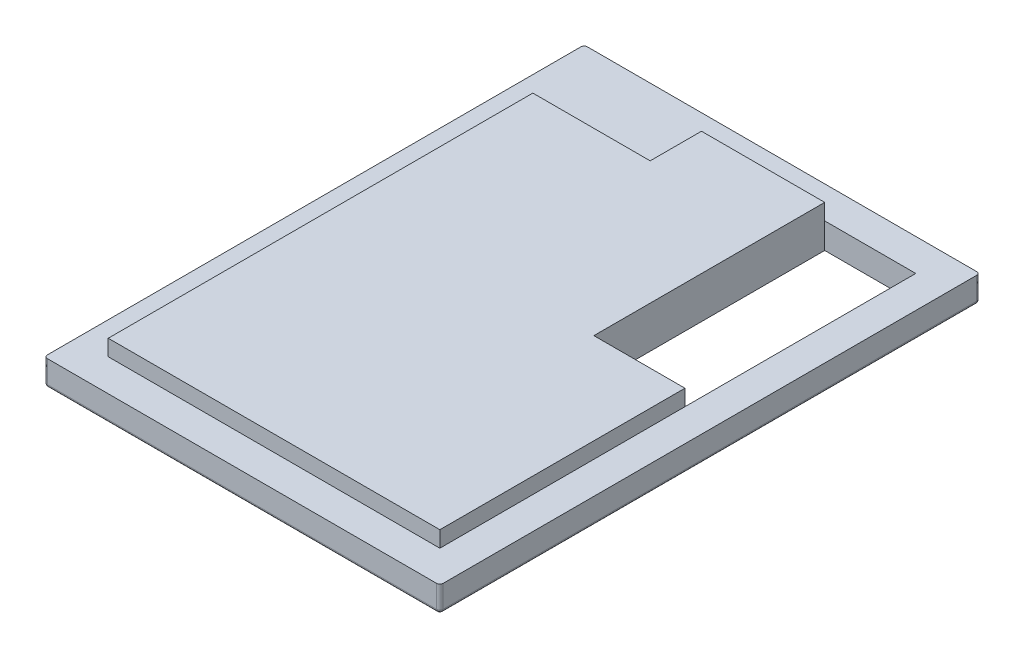
ISO-10303-21;
HEADER;
FILE_DESCRIPTION(('STEP AP214'),'2;1');
FILE_NAME('part.step','',(''),(''),'','','');
FILE_SCHEMA(('AUTOMOTIVE_DESIGN { 1 0 10303 214 1 1 1 1 }'));
ENDSEC;
DATA;
#1=APPLICATION_CONTEXT('core data for automotive mechanical design processes');
#2=APPLICATION_PROTOCOL_DEFINITION('international standard','automotive_design',2000,#1);
#3=PRODUCT_CONTEXT('',#1,'mechanical');
#4=PRODUCT('Part','Part','',(#3));
#5=PRODUCT_RELATED_PRODUCT_CATEGORY('part','',(#4));
#6=PRODUCT_DEFINITION_FORMATION('','',#4);
#7=PRODUCT_DEFINITION_CONTEXT('part definition',#1,'design');
#8=PRODUCT_DEFINITION('design','',#6,#7);
#9=PRODUCT_DEFINITION_SHAPE('','',#8);
#10=(LENGTH_UNIT() NAMED_UNIT(*) SI_UNIT(.MILLI.,.METRE.));
#11=(NAMED_UNIT(*) PLANE_ANGLE_UNIT() SI_UNIT($,.RADIAN.));
#12=(NAMED_UNIT(*) SI_UNIT($,.STERADIAN.) SOLID_ANGLE_UNIT());
#13=UNCERTAINTY_MEASURE_WITH_UNIT(LENGTH_MEASURE(1.E-05),#10,'distance_accuracy_value','');
#14=(GEOMETRIC_REPRESENTATION_CONTEXT(3) GLOBAL_UNCERTAINTY_ASSIGNED_CONTEXT((#13)) GLOBAL_UNIT_ASSIGNED_CONTEXT((#10,
#11,#12)) REPRESENTATION_CONTEXT('',''));
#15=CARTESIAN_POINT('',(0.,0.,0.));
#16=DIRECTION('',(0.,0.,1.));
#17=DIRECTION('',(1.,0.,0.));
#18=AXIS2_PLACEMENT_3D('',#15,#16,#17);
#19=CARTESIAN_POINT('',(15.43,3.25,21.055));
#20=DIRECTION('',(-1.,0.,0.));
#21=DIRECTION('',(0.,0.,1.));
#22=AXIS2_PLACEMENT_3D('',#19,#20,#21);
#23=PLANE('',#22);
#24=DIRECTION('',(0.,0.,-1.));
#25=VECTOR('',#24,1.);
#26=CARTESIAN_POINT('',(15.43,0.25,-21.055));
#27=LINE('',#26,#25);
#28=CARTESIAN_POINT('',(15.43,0.25,20.805));
#29=VERTEX_POINT('',#28);
#30=CARTESIAN_POINT('',(15.43,0.25,-20.805));
#31=VERTEX_POINT('',#30);
#32=EDGE_CURVE('E231',#29,#31,#27,.T.);
#33=ORIENTED_EDGE('',*,*,#32,.T.);
#34=DIRECTION('',(0.,-1.,0.));
#35=VECTOR('',#34,1.);
#36=CARTESIAN_POINT('',(15.43,3.25,-20.805));
#37=LINE('',#36,#35);
#38=CARTESIAN_POINT('',(15.43,2.,-20.805));
#39=VERTEX_POINT('',#38);
#40=EDGE_CURVE('E234',#31,#39,#37,.F.);
#41=ORIENTED_EDGE('',*,*,#40,.T.);
#42=DIRECTION('',(0.,0.,-1.));
#43=VECTOR('',#42,1.);
#44=CARTESIAN_POINT('',(15.43,2.,21.055));
#45=LINE('',#44,#43);
#46=CARTESIAN_POINT('',(15.43,2.,20.805));
#47=VERTEX_POINT('',#46);
#48=EDGE_CURVE('E223',#47,#39,#45,.T.);
#49=ORIENTED_EDGE('',*,*,#48,.F.);
#50=DIRECTION('',(0.,-1.,0.));
#51=VECTOR('',#50,1.);
#52=CARTESIAN_POINT('',(15.43,3.25,20.805));
#53=LINE('',#52,#51);
#54=EDGE_CURVE('E229',#47,#29,#53,.T.);
#55=ORIENTED_EDGE('',*,*,#54,.T.);
#56=EDGE_LOOP('',(#33,#41,#49,#55));
#57=FACE_BOUND('',#56,.T.);
#58=ADVANCED_FACE('F36',(#57),#23,.F.);
#59=CARTESIAN_POINT('',(-15.43,3.25,-21.055));
#60=DIRECTION('',(0.,0.,1.));
#61=DIRECTION('',(1.,0.,0.));
#62=AXIS2_PLACEMENT_3D('',#59,#60,#61);
#63=PLANE('',#62);
#64=DIRECTION('',(-1.,0.,0.));
#65=VECTOR('',#64,1.);
#66=CARTESIAN_POINT('',(-15.43,2.,-21.055));
#67=LINE('',#66,#65);
#68=CARTESIAN_POINT('',(15.18,2.,-21.055));
#69=VERTEX_POINT('',#68);
#70=CARTESIAN_POINT('',(-15.18,2.,-21.055));
#71=VERTEX_POINT('',#70);
#72=EDGE_CURVE('E220',#69,#71,#67,.T.);
#73=ORIENTED_EDGE('',*,*,#72,.F.);
#74=DIRECTION('',(0.,-1.,0.));
#75=VECTOR('',#74,1.);
#76=CARTESIAN_POINT('',(15.18,3.25,-21.055));
#77=LINE('',#76,#75);
#78=CARTESIAN_POINT('',(15.18,0.25,-21.055));
#79=VERTEX_POINT('',#78);
#80=EDGE_CURVE('E249',#69,#79,#77,.T.);
#81=ORIENTED_EDGE('',*,*,#80,.T.);
#82=DIRECTION('',(-1.,0.,0.));
#83=VECTOR('',#82,1.);
#84=CARTESIAN_POINT('',(-15.43,0.25,-21.055));
#85=LINE('',#84,#83);
#86=CARTESIAN_POINT('',(-15.18,0.25,-21.055));
#87=VERTEX_POINT('',#86);
#88=EDGE_CURVE('E247',#79,#87,#85,.T.);
#89=ORIENTED_EDGE('',*,*,#88,.T.);
#90=DIRECTION('',(0.,-1.,0.));
#91=VECTOR('',#90,1.);
#92=CARTESIAN_POINT('',(-15.18,3.25,-21.055));
#93=LINE('',#92,#91);
#94=EDGE_CURVE('E245',#87,#71,#93,.F.);
#95=ORIENTED_EDGE('',*,*,#94,.T.);
#96=EDGE_LOOP('',(#73,#81,#89,#95));
#97=FACE_BOUND('',#96,.T.);
#98=ADVANCED_FACE('F335',(#97),#63,.F.);
#99=CARTESIAN_POINT('',(-15.43,3.25,21.055));
#100=DIRECTION('',(1.,0.,0.));
#101=DIRECTION('',(0.,0.,-1.));
#102=AXIS2_PLACEMENT_3D('',#99,#100,#101);
#103=PLANE('',#102);
#104=DIRECTION('',(0.,0.,1.));
#105=VECTOR('',#104,1.);
#106=CARTESIAN_POINT('',(-15.43,2.,21.055));
#107=LINE('',#106,#105);
#108=CARTESIAN_POINT('',(-15.43,2.,-20.805));
#109=VERTEX_POINT('',#108);
#110=CARTESIAN_POINT('',(-15.43,2.,20.805));
#111=VERTEX_POINT('',#110);
#112=EDGE_CURVE('E216',#109,#111,#107,.T.);
#113=ORIENTED_EDGE('',*,*,#112,.F.);
#114=DIRECTION('',(0.,-1.,0.));
#115=VECTOR('',#114,1.);
#116=CARTESIAN_POINT('',(-15.43,3.25,-20.805));
#117=LINE('',#116,#115);
#118=CARTESIAN_POINT('',(-15.43,0.25,-20.805));
#119=VERTEX_POINT('',#118);
#120=EDGE_CURVE('E263',#109,#119,#117,.T.);
#121=ORIENTED_EDGE('',*,*,#120,.T.);
#122=DIRECTION('',(0.,0.,1.));
#123=VECTOR('',#122,1.);
#124=CARTESIAN_POINT('',(-15.43,0.25,21.055));
#125=LINE('',#124,#123);
#126=CARTESIAN_POINT('',(-15.43,0.25,20.805));
#127=VERTEX_POINT('',#126);
#128=EDGE_CURVE('E261',#119,#127,#125,.T.);
#129=ORIENTED_EDGE('',*,*,#128,.T.);
#130=DIRECTION('',(0.,-1.,0.));
#131=VECTOR('',#130,1.);
#132=CARTESIAN_POINT('',(-15.43,3.25,20.805));
#133=LINE('',#132,#131);
#134=EDGE_CURVE('E259',#127,#111,#133,.F.);
#135=ORIENTED_EDGE('',*,*,#134,.T.);
#136=EDGE_LOOP('',(#113,#121,#129,#135));
#137=FACE_BOUND('',#136,.T.);
#138=ADVANCED_FACE('F357',(#137),#103,.F.);
#139=CARTESIAN_POINT('',(-15.43,3.25,21.055));
#140=DIRECTION('',(0.,0.,-1.));
#141=DIRECTION('',(-1.,0.,0.));
#142=AXIS2_PLACEMENT_3D('',#139,#140,#141);
#143=PLANE('',#142);
#144=DIRECTION('',(1.,0.,0.));
#145=VECTOR('',#144,1.);
#146=CARTESIAN_POINT('',(-15.43,2.,21.055));
#147=LINE('',#146,#145);
#148=CARTESIAN_POINT('',(-15.18,2.,21.055));
#149=VERTEX_POINT('',#148);
#150=CARTESIAN_POINT('',(15.18,2.,21.055));
#151=VERTEX_POINT('',#150);
#152=EDGE_CURVE('E226',#149,#151,#147,.T.);
#153=ORIENTED_EDGE('',*,*,#152,.F.);
#154=DIRECTION('',(0.,-1.,0.));
#155=VECTOR('',#154,1.);
#156=CARTESIAN_POINT('',(-15.18,3.25,21.055));
#157=LINE('',#156,#155);
#158=CARTESIAN_POINT('',(-15.18,0.25,21.055));
#159=VERTEX_POINT('',#158);
#160=EDGE_CURVE('E13',#149,#159,#157,.T.);
#161=ORIENTED_EDGE('',*,*,#160,.T.);
#162=DIRECTION('',(1.,0.,0.));
#163=VECTOR('',#162,1.);
#164=CARTESIAN_POINT('',(15.43,0.25,21.055));
#165=LINE('',#164,#163);
#166=CARTESIAN_POINT('',(15.18,0.25,21.055));
#167=VERTEX_POINT('',#166);
#168=EDGE_CURVE('E45',#159,#167,#165,.T.);
#169=ORIENTED_EDGE('',*,*,#168,.T.);
#170=DIRECTION('',(0.,-1.,0.));
#171=VECTOR('',#170,1.);
#172=CARTESIAN_POINT('',(15.18,3.25,21.055));
#173=LINE('',#172,#171);
#174=EDGE_CURVE('E265',#167,#151,#173,.F.);
#175=ORIENTED_EDGE('',*,*,#174,.T.);
#176=EDGE_LOOP('',(#153,#161,#169,#175));
#177=FACE_BOUND('',#176,.T.);
#178=ADVANCED_FACE('F315',(#177),#143,.F.);
#179=CARTESIAN_POINT('',(0.,0.,0.));
#180=DIRECTION('',(0.,-1.,0.));
#181=DIRECTION('',(0.,0.,-1.));
#182=AXIS2_PLACEMENT_3D('',#179,#180,#181);
#183=PLANE('',#182);
#184=DIRECTION('',(0.,0.,1.));
#185=VECTOR('',#184,1.);
#186=CARTESIAN_POINT('',(12.93,0.,-18.555));
#187=LINE('',#186,#185);
#188=CARTESIAN_POINT('',(12.93,0.,-18.555));
#189=VERTEX_POINT('',#188);
#190=CARTESIAN_POINT('',(12.93,0.,-0.555000000000003));
#191=VERTEX_POINT('',#190);
#192=EDGE_CURVE('E61',#189,#191,#187,.T.);
#193=ORIENTED_EDGE('',*,*,#192,.F.);
#194=DIRECTION('',(1.,0.,0.));
#195=VECTOR('',#194,1.);
#196=CARTESIAN_POINT('',(12.93,0.,-18.555));
#197=LINE('',#196,#195);
#198=CARTESIAN_POINT('',(5.82999999999999,0.,-18.555));
#199=VERTEX_POINT('',#198);
#200=EDGE_CURVE('E621',#199,#189,#197,.T.);
#201=ORIENTED_EDGE('',*,*,#200,.F.);
#202=DIRECTION('',(0.,0.,-1.));
#203=VECTOR('',#202,1.);
#204=CARTESIAN_POINT('',(5.82999999999999,0.,-18.555));
#205=LINE('',#204,#203);
#206=CARTESIAN_POINT('',(5.82999999999999,0.,-0.555000000000003));
#207=VERTEX_POINT('',#206);
#208=EDGE_CURVE('E626',#207,#199,#205,.T.);
#209=ORIENTED_EDGE('',*,*,#208,.F.);
#210=DIRECTION('',(-1.,0.,0.));
#211=VECTOR('',#210,1.);
#212=CARTESIAN_POINT('',(12.93,0.,-0.555000000000003));
#213=LINE('',#212,#211);
#214=EDGE_CURVE('E623',#191,#207,#213,.T.);
#215=ORIENTED_EDGE('',*,*,#214,.F.);
#216=EDGE_LOOP('',(#193,#201,#209,#215));
#217=FACE_BOUND('',#216,.T.);
#218=DIRECTION('',(-1.,0.,0.));
#219=VECTOR('',#218,1.);
#220=CARTESIAN_POINT('',(15.43,0.,-20.805));
#221=LINE('',#220,#219);
#222=CARTESIAN_POINT('',(-15.18,0.,-20.805));
#223=VERTEX_POINT('',#222);
#224=CARTESIAN_POINT('',(15.18,0.,-20.805));
#225=VERTEX_POINT('',#224);
#226=EDGE_CURVE('E240',#223,#225,#221,.F.);
#227=ORIENTED_EDGE('',*,*,#226,.T.);
#228=DIRECTION('',(0.,0.,-1.));
#229=VECTOR('',#228,1.);
#230=CARTESIAN_POINT('',(15.18,0.,21.055));
#231=LINE('',#230,#229);
#232=CARTESIAN_POINT('',(15.18,0.,20.805));
#233=VERTEX_POINT('',#232);
#234=EDGE_CURVE('E242',#225,#233,#231,.F.);
#235=ORIENTED_EDGE('',*,*,#234,.T.);
#236=DIRECTION('',(1.,0.,0.));
#237=VECTOR('',#236,1.);
#238=CARTESIAN_POINT('',(-15.43,0.,20.805));
#239=LINE('',#238,#237);
#240=CARTESIAN_POINT('',(-15.18,0.,20.805));
#241=VERTEX_POINT('',#240);
#242=EDGE_CURVE('E236',#233,#241,#239,.F.);
#243=ORIENTED_EDGE('',*,*,#242,.T.);
#244=DIRECTION('',(0.,0.,1.));
#245=VECTOR('',#244,1.);
#246=CARTESIAN_POINT('',(-15.18,0.,-21.055));
#247=LINE('',#246,#245);
#248=EDGE_CURVE('E238',#241,#223,#247,.F.);
#249=ORIENTED_EDGE('',*,*,#248,.T.);
#250=EDGE_LOOP('',(#227,#235,#243,#249));
#251=FACE_BOUND('',#250,.T.);
#252=ADVANCED_FACE('F352',(#217,#251),#183,.T.);
#253=CARTESIAN_POINT('',(0.,2.,0.));
#254=DIRECTION('',(0.,1.,0.));
#255=DIRECTION('',(0.,0.,1.));
#256=AXIS2_PLACEMENT_3D('',#253,#254,#255);
#257=PLANE('',#256);
#258=DIRECTION('',(0.,0.,1.));
#259=VECTOR('',#258,1.);
#260=CARTESIAN_POINT('',(-12.93,2.,-18.555));
#261=LINE('',#260,#259);
#262=CARTESIAN_POINT('',(-12.93,2.,-14.555));
#263=VERTEX_POINT('',#262);
#264=CARTESIAN_POINT('',(-12.93,2.,18.555));
#265=VERTEX_POINT('',#264);
#266=EDGE_CURVE('E187',#263,#265,#261,.T.);
#267=ORIENTED_EDGE('',*,*,#266,.F.);
#268=DIRECTION('',(1.,0.,0.));
#269=VECTOR('',#268,1.);
#270=CARTESIAN_POINT('',(-12.93,2.,-14.555));
#271=LINE('',#270,#269);
#272=CARTESIAN_POINT('',(-3.78,2.,-14.555));
#273=VERTEX_POINT('',#272);
#274=EDGE_CURVE('E173',#263,#273,#271,.T.);
#275=ORIENTED_EDGE('',*,*,#274,.T.);
#276=DIRECTION('',(0.,0.,-1.));
#277=VECTOR('',#276,1.);
#278=CARTESIAN_POINT('',(-3.78000000000001,2.,-18.555));
#279=LINE('',#278,#277);
#280=CARTESIAN_POINT('',(-3.78000000000001,2.,-18.555));
#281=VERTEX_POINT('',#280);
#282=EDGE_CURVE('E180',#273,#281,#279,.T.);
#283=ORIENTED_EDGE('',*,*,#282,.T.);
#284=DIRECTION('',(-1.,0.,0.));
#285=VECTOR('',#284,1.);
#286=CARTESIAN_POINT('',(12.93,2.,-18.555));
#287=LINE('',#286,#285);
#288=CARTESIAN_POINT('',(5.82999999999999,2.,-18.555));
#289=VERTEX_POINT('',#288);
#290=EDGE_CURVE('E202',#289,#281,#287,.T.);
#291=ORIENTED_EDGE('',*,*,#290,.F.);
#292=CARTESIAN_POINT('',(12.93,2.,-18.555));
#293=VERTEX_POINT('',#292);
#294=EDGE_CURVE('E198',#293,#289,#287,.T.);
#295=ORIENTED_EDGE('',*,*,#294,.F.);
#296=DIRECTION('',(0.,0.,-1.));
#297=VECTOR('',#296,1.);
#298=CARTESIAN_POINT('',(12.93,2.,0.));
#299=LINE('',#298,#297);
#300=CARTESIAN_POINT('',(12.93,2.,-0.555000000000003));
#301=VERTEX_POINT('',#300);
#302=EDGE_CURVE('E271',#301,#293,#299,.T.);
#303=ORIENTED_EDGE('',*,*,#302,.F.);
#304=DIRECTION('',(0.,0.,-1.));
#305=VECTOR('',#304,1.);
#306=CARTESIAN_POINT('',(12.93,2.,18.555));
#307=LINE('',#306,#305);
#308=CARTESIAN_POINT('',(12.93,2.,18.555));
#309=VERTEX_POINT('',#308);
#310=EDGE_CURVE('E651',#309,#301,#307,.T.);
#311=ORIENTED_EDGE('',*,*,#310,.F.);
#312=DIRECTION('',(1.,0.,0.));
#313=VECTOR('',#312,1.);
#314=CARTESIAN_POINT('',(-12.93,2.,18.555));
#315=LINE('',#314,#313);
#316=EDGE_CURVE('E196',#265,#309,#315,.T.);
#317=ORIENTED_EDGE('',*,*,#316,.F.);
#318=EDGE_LOOP('',(#267,#275,#283,#291,#295,#303,#311,#317));
#319=FACE_BOUND('',#318,.T.);
#320=ORIENTED_EDGE('',*,*,#48,.T.);
#321=CARTESIAN_POINT('',(15.18,2.,-20.805));
#322=DIRECTION('',(0.,1.,0.));
#323=DIRECTION('',(0.,0.,1.));
#324=AXIS2_PLACEMENT_3D('',#321,#322,#323);
#325=CIRCLE('',#324,0.25);
#326=EDGE_CURVE('E257',#39,#69,#325,.T.);
#327=ORIENTED_EDGE('',*,*,#326,.T.);
#328=ORIENTED_EDGE('',*,*,#72,.T.);
#329=CARTESIAN_POINT('',(-15.18,2.,-20.805));
#330=DIRECTION('',(0.,1.,0.));
#331=DIRECTION('',(0.,0.,1.));
#332=AXIS2_PLACEMENT_3D('',#329,#330,#331);
#333=CIRCLE('',#332,0.25);
#334=EDGE_CURVE('E255',#71,#109,#333,.T.);
#335=ORIENTED_EDGE('',*,*,#334,.T.);
#336=ORIENTED_EDGE('',*,*,#112,.T.);
#337=CARTESIAN_POINT('',(-15.18,2.,20.805));
#338=DIRECTION('',(0.,1.,0.));
#339=DIRECTION('',(0.,0.,1.));
#340=AXIS2_PLACEMENT_3D('',#337,#338,#339);
#341=CIRCLE('',#340,0.25);
#342=EDGE_CURVE('E253',#111,#149,#341,.T.);
#343=ORIENTED_EDGE('',*,*,#342,.T.);
#344=ORIENTED_EDGE('',*,*,#152,.T.);
#345=CARTESIAN_POINT('',(15.18,2.,20.805));
#346=DIRECTION('',(0.,1.,0.));
#347=DIRECTION('',(0.,0.,1.));
#348=AXIS2_PLACEMENT_3D('',#345,#346,#347);
#349=CIRCLE('',#348,0.25);
#350=EDGE_CURVE('E251',#151,#47,#349,.T.);
#351=ORIENTED_EDGE('',*,*,#350,.T.);
#352=EDGE_LOOP('',(#320,#327,#328,#335,#336,#343,#344,#351));
#353=FACE_BOUND('',#352,.T.);
#354=ADVANCED_FACE('F192',(#319,#353),#257,.T.);
#355=CARTESIAN_POINT('',(-12.93,2.,18.555));
#356=DIRECTION('',(0.,0.,1.));
#357=DIRECTION('',(1.,0.,0.));
#358=AXIS2_PLACEMENT_3D('',#355,#356,#357);
#359=PLANE('',#358);
#360=DIRECTION('',(1.,0.,0.));
#361=VECTOR('',#360,1.);
#362=CARTESIAN_POINT('',(-12.93,3.25,18.555));
#363=LINE('',#362,#361);
#364=CARTESIAN_POINT('',(-12.93,3.25,18.555));
#365=VERTEX_POINT('',#364);
#366=CARTESIAN_POINT('',(12.93,3.25,18.555));
#367=VERTEX_POINT('',#366);
#368=EDGE_CURVE('E206',#365,#367,#363,.T.);
#369=ORIENTED_EDGE('',*,*,#368,.F.);
#370=DIRECTION('',(0.,1.,0.));
#371=VECTOR('',#370,1.);
#372=CARTESIAN_POINT('',(-12.93,2.,18.555));
#373=LINE('',#372,#371);
#374=EDGE_CURVE('E200',#265,#365,#373,.T.);
#375=ORIENTED_EDGE('',*,*,#374,.F.);
#376=ORIENTED_EDGE('',*,*,#316,.T.);
#377=DIRECTION('',(0.,1.,0.));
#378=VECTOR('',#377,1.);
#379=CARTESIAN_POINT('',(12.93,2.,18.555));
#380=LINE('',#379,#378);
#381=EDGE_CURVE('E197',#309,#367,#380,.T.);
#382=ORIENTED_EDGE('',*,*,#381,.T.);
#383=EDGE_LOOP('',(#369,#375,#376,#382));
#384=FACE_BOUND('',#383,.T.);
#385=ADVANCED_FACE('F502',(#384),#359,.T.);
#386=CARTESIAN_POINT('',(-12.93,2.,-18.555));
#387=DIRECTION('',(-1.,0.,0.));
#388=DIRECTION('',(0.,0.,1.));
#389=AXIS2_PLACEMENT_3D('',#386,#387,#388);
#390=PLANE('',#389);
#391=DIRECTION('',(0.,1.,0.));
#392=VECTOR('',#391,1.);
#393=CARTESIAN_POINT('',(-12.93,2.,-14.555));
#394=LINE('',#393,#392);
#395=CARTESIAN_POINT('',(-12.93,3.25,-14.555));
#396=VERTEX_POINT('',#395);
#397=EDGE_CURVE('E53',#263,#396,#394,.T.);
#398=ORIENTED_EDGE('',*,*,#397,.F.);
#399=ORIENTED_EDGE('',*,*,#266,.T.);
#400=ORIENTED_EDGE('',*,*,#374,.T.);
#401=DIRECTION('',(0.,0.,1.));
#402=VECTOR('',#401,1.);
#403=CARTESIAN_POINT('',(-12.93,3.25,-18.555));
#404=LINE('',#403,#402);
#405=EDGE_CURVE('E189',#396,#365,#404,.T.);
#406=ORIENTED_EDGE('',*,*,#405,.F.);
#407=EDGE_LOOP('',(#398,#399,#400,#406));
#408=FACE_BOUND('',#407,.T.);
#409=ADVANCED_FACE('F185',(#408),#390,.T.);
#410=CARTESIAN_POINT('',(12.93,2.,-18.555));
#411=DIRECTION('',(0.,0.,-1.));
#412=DIRECTION('',(-1.,0.,0.));
#413=AXIS2_PLACEMENT_3D('',#410,#411,#412);
#414=PLANE('',#413);
#415=DIRECTION('',(0.,1.,0.));
#416=VECTOR('',#415,1.);
#417=CARTESIAN_POINT('',(-3.78000000000001,2.,-18.555));
#418=LINE('',#417,#416);
#419=CARTESIAN_POINT('',(-3.78000000000001,3.25,-18.555));
#420=VERTEX_POINT('',#419);
#421=EDGE_CURVE('E624',#281,#420,#418,.T.);
#422=ORIENTED_EDGE('',*,*,#421,.T.);
#423=DIRECTION('',(-1.,0.,0.));
#424=VECTOR('',#423,1.);
#425=CARTESIAN_POINT('',(12.93,3.25,-18.555));
#426=LINE('',#425,#424);
#427=CARTESIAN_POINT('',(5.82999999999999,3.25,-18.555));
#428=VERTEX_POINT('',#427);
#429=EDGE_CURVE('E212',#428,#420,#426,.T.);
#430=ORIENTED_EDGE('',*,*,#429,.F.);
#431=DIRECTION('',(0.,-1.,0.));
#432=VECTOR('',#431,1.);
#433=CARTESIAN_POINT('',(5.82999999999999,3.25,-18.555));
#434=LINE('',#433,#432);
#435=EDGE_CURVE('E640',#428,#289,#434,.T.);
#436=ORIENTED_EDGE('',*,*,#435,.T.);
#437=ORIENTED_EDGE('',*,*,#290,.T.);
#438=EDGE_LOOP('',(#422,#430,#436,#437));
#439=FACE_BOUND('',#438,.T.);
#440=ADVANCED_FACE('F552',(#439),#414,.T.);
#441=CARTESIAN_POINT('',(12.93,2.,18.555));
#442=DIRECTION('',(1.,0.,0.));
#443=DIRECTION('',(0.,0.,-1.));
#444=AXIS2_PLACEMENT_3D('',#441,#442,#443);
#445=PLANE('',#444);
#446=DIRECTION('',(0.,-1.,0.));
#447=VECTOR('',#446,1.);
#448=CARTESIAN_POINT('',(12.93,3.25,-0.555000000000003));
#449=LINE('',#448,#447);
#450=CARTESIAN_POINT('',(12.93,3.25,-0.555000000000003));
#451=VERTEX_POINT('',#450);
#452=EDGE_CURVE('E646',#451,#301,#449,.T.);
#453=ORIENTED_EDGE('',*,*,#452,.F.);
#454=DIRECTION('',(0.,0.,-1.));
#455=VECTOR('',#454,1.);
#456=CARTESIAN_POINT('',(12.93,3.25,18.555));
#457=LINE('',#456,#455);
#458=EDGE_CURVE('E209',#367,#451,#457,.T.);
#459=ORIENTED_EDGE('',*,*,#458,.F.);
#460=ORIENTED_EDGE('',*,*,#381,.F.);
#461=ORIENTED_EDGE('',*,*,#310,.T.);
#462=EDGE_LOOP('',(#453,#459,#460,#461));
#463=FACE_BOUND('',#462,.T.);
#464=ADVANCED_FACE('F366',(#463),#445,.T.);
#465=CARTESIAN_POINT('',(0.,3.25,0.));
#466=DIRECTION('',(0.,-1.,0.));
#467=DIRECTION('',(0.,0.,-1.));
#468=AXIS2_PLACEMENT_3D('',#465,#466,#467);
#469=PLANE('',#468);
#470=ORIENTED_EDGE('',*,*,#429,.T.);
#471=DIRECTION('',(0.,0.,-1.));
#472=VECTOR('',#471,1.);
#473=CARTESIAN_POINT('',(-3.78000000000001,3.25,-18.555));
#474=LINE('',#473,#472);
#475=CARTESIAN_POINT('',(-3.78,3.25,-14.555));
#476=VERTEX_POINT('',#475);
#477=EDGE_CURVE('E181',#476,#420,#474,.T.);
#478=ORIENTED_EDGE('',*,*,#477,.F.);
#479=DIRECTION('',(1.,0.,0.));
#480=VECTOR('',#479,1.);
#481=CARTESIAN_POINT('',(-12.93,3.25,-14.555));
#482=LINE('',#481,#480);
#483=EDGE_CURVE('E661',#396,#476,#482,.T.);
#484=ORIENTED_EDGE('',*,*,#483,.F.);
#485=ORIENTED_EDGE('',*,*,#405,.T.);
#486=ORIENTED_EDGE('',*,*,#368,.T.);
#487=ORIENTED_EDGE('',*,*,#458,.T.);
#488=DIRECTION('',(-1.,0.,0.));
#489=VECTOR('',#488,1.);
#490=CARTESIAN_POINT('',(12.93,3.25,-0.555000000000003));
#491=LINE('',#490,#489);
#492=CARTESIAN_POINT('',(5.82999999999999,3.25,-0.555000000000003));
#493=VERTEX_POINT('',#492);
#494=EDGE_CURVE('E637',#451,#493,#491,.T.);
#495=ORIENTED_EDGE('',*,*,#494,.T.);
#496=DIRECTION('',(0.,0.,-1.));
#497=VECTOR('',#496,1.);
#498=CARTESIAN_POINT('',(5.82999999999999,3.25,-18.555));
#499=LINE('',#498,#497);
#500=EDGE_CURVE('E631',#493,#428,#499,.T.);
#501=ORIENTED_EDGE('',*,*,#500,.T.);
#502=EDGE_LOOP('',(#470,#478,#484,#485,#486,#487,#495,#501));
#503=FACE_BOUND('',#502,.T.);
#504=ADVANCED_FACE('F361',(#503),#469,.F.);
#505=CARTESIAN_POINT('',(-15.18,3.25,20.805));
#506=DIRECTION('',(0.,-1.,0.));
#507=DIRECTION('',(0.,0.,-1.));
#508=AXIS2_PLACEMENT_3D('',#505,#506,#507);
#509=CYLINDRICAL_SURFACE('',#508,0.25);
#510=ORIENTED_EDGE('',*,*,#342,.F.);
#511=ORIENTED_EDGE('',*,*,#134,.F.);
#512=CARTESIAN_POINT('',(-15.18,0.25,20.805));
#513=DIRECTION('',(0.,-1.,0.));
#514=DIRECTION('',(0.,0.,-1.));
#515=AXIS2_PLACEMENT_3D('',#512,#513,#514);
#516=CIRCLE('',#515,0.25);
#517=EDGE_CURVE('E296',#159,#127,#516,.T.);
#518=ORIENTED_EDGE('',*,*,#517,.F.);
#519=ORIENTED_EDGE('',*,*,#160,.F.);
#520=EDGE_LOOP('',(#510,#511,#518,#519));
#521=FACE_BOUND('',#520,.T.);
#522=ADVANCED_FACE('F38',(#521),#509,.T.);
#523=CARTESIAN_POINT('',(-15.18,3.25,-20.805));
#524=DIRECTION('',(0.,-1.,0.));
#525=DIRECTION('',(0.,0.,-1.));
#526=AXIS2_PLACEMENT_3D('',#523,#524,#525);
#527=CYLINDRICAL_SURFACE('',#526,0.25);
#528=ORIENTED_EDGE('',*,*,#334,.F.);
#529=ORIENTED_EDGE('',*,*,#94,.F.);
#530=CARTESIAN_POINT('',(-15.18,0.25,-20.805));
#531=DIRECTION('',(0.,-1.,0.));
#532=DIRECTION('',(0.,0.,-1.));
#533=AXIS2_PLACEMENT_3D('',#530,#531,#532);
#534=CIRCLE('',#533,0.25);
#535=EDGE_CURVE('E294',#119,#87,#534,.T.);
#536=ORIENTED_EDGE('',*,*,#535,.F.);
#537=ORIENTED_EDGE('',*,*,#120,.F.);
#538=EDGE_LOOP('',(#528,#529,#536,#537));
#539=FACE_BOUND('',#538,.T.);
#540=ADVANCED_FACE('F340',(#539),#527,.T.);
#541=CARTESIAN_POINT('',(-15.18,0.25,21.055));
#542=DIRECTION('',(0.,0.,-1.));
#543=DIRECTION('',(-1.,0.,0.));
#544=AXIS2_PLACEMENT_3D('',#541,#542,#543);
#545=CYLINDRICAL_SURFACE('',#544,0.25);
#546=CARTESIAN_POINT('',(-15.18,0.25,20.805));
#547=DIRECTION('',(0.,0.,1.));
#548=DIRECTION('',(1.,0.,0.));
#549=AXIS2_PLACEMENT_3D('',#546,#547,#548);
#550=CIRCLE('',#549,0.25);
#551=EDGE_CURVE('E40',#127,#241,#550,.T.);
#552=ORIENTED_EDGE('',*,*,#551,.F.);
#553=ORIENTED_EDGE('',*,*,#128,.F.);
#554=CARTESIAN_POINT('',(-15.18,0.25,-20.805));
#555=DIRECTION('',(0.,0.,-1.));
#556=DIRECTION('',(-1.,0.,0.));
#557=AXIS2_PLACEMENT_3D('',#554,#555,#556);
#558=CIRCLE('',#557,0.25);
#559=EDGE_CURVE('E291',#223,#119,#558,.T.);
#560=ORIENTED_EDGE('',*,*,#559,.F.);
#561=ORIENTED_EDGE('',*,*,#248,.F.);
#562=EDGE_LOOP('',(#552,#553,#560,#561));
#563=FACE_BOUND('',#562,.T.);
#564=ADVANCED_FACE('F353',(#563),#545,.T.);
#565=CARTESIAN_POINT('',(-15.18,0.25,20.805));
#566=DIRECTION('',(0.,0.,1.));
#567=DIRECTION('',(1.,0.,0.));
#568=AXIS2_PLACEMENT_3D('',#565,#566,#567);
#569=SPHERICAL_SURFACE('',#568,0.25);
#570=ORIENTED_EDGE('',*,*,#517,.T.);
#571=ORIENTED_EDGE('',*,*,#551,.T.);
#572=CARTESIAN_POINT('',(-15.18,0.25,20.805));
#573=DIRECTION('',(-1.,0.,0.));
#574=DIRECTION('',(0.,0.,1.));
#575=AXIS2_PLACEMENT_3D('',#572,#573,#574);
#576=CIRCLE('',#575,0.25);
#577=EDGE_CURVE('E288',#159,#241,#576,.F.);
#578=ORIENTED_EDGE('',*,*,#577,.F.);
#579=EDGE_LOOP('',(#570,#571,#578));
#580=FACE_BOUND('',#579,.T.);
#581=ADVANCED_FACE('F303',(#580),#569,.T.);
#582=CARTESIAN_POINT('',(-15.18,0.25,-20.805));
#583=DIRECTION('',(0.,0.,1.));
#584=DIRECTION('',(1.,0.,0.));
#585=AXIS2_PLACEMENT_3D('',#582,#583,#584);
#586=SPHERICAL_SURFACE('',#585,0.25);
#587=ORIENTED_EDGE('',*,*,#559,.T.);
#588=ORIENTED_EDGE('',*,*,#535,.T.);
#589=CARTESIAN_POINT('',(-15.18,0.25,-20.805));
#590=DIRECTION('',(-1.,0.,0.));
#591=DIRECTION('',(0.,0.,1.));
#592=AXIS2_PLACEMENT_3D('',#589,#590,#591);
#593=CIRCLE('',#592,0.25);
#594=EDGE_CURVE('E285',#223,#87,#593,.F.);
#595=ORIENTED_EDGE('',*,*,#594,.F.);
#596=EDGE_LOOP('',(#587,#588,#595));
#597=FACE_BOUND('',#596,.T.);
#598=ADVANCED_FACE('F344',(#597),#586,.T.);
#599=CARTESIAN_POINT('',(-15.43,0.25,20.805));
#600=DIRECTION('',(-1.,0.,0.));
#601=DIRECTION('',(0.,0.,1.));
#602=AXIS2_PLACEMENT_3D('',#599,#600,#601);
#603=CYLINDRICAL_SURFACE('',#602,0.25);
#604=ORIENTED_EDGE('',*,*,#577,.T.);
#605=ORIENTED_EDGE('',*,*,#242,.F.);
#606=CARTESIAN_POINT('',(15.18,0.25,20.805));
#607=DIRECTION('',(1.,0.,0.));
#608=DIRECTION('',(0.,0.,-1.));
#609=AXIS2_PLACEMENT_3D('',#606,#607,#608);
#610=CIRCLE('',#609,0.25);
#611=EDGE_CURVE('E282',#167,#233,#610,.T.);
#612=ORIENTED_EDGE('',*,*,#611,.F.);
#613=ORIENTED_EDGE('',*,*,#168,.F.);
#614=EDGE_LOOP('',(#604,#605,#612,#613));
#615=FACE_BOUND('',#614,.T.);
#616=ADVANCED_FACE('F310',(#615),#603,.T.);
#617=CARTESIAN_POINT('',(15.18,3.25,20.805));
#618=DIRECTION('',(0.,-1.,0.));
#619=DIRECTION('',(0.,0.,-1.));
#620=AXIS2_PLACEMENT_3D('',#617,#618,#619);
#621=CYLINDRICAL_SURFACE('',#620,0.25);
#622=ORIENTED_EDGE('',*,*,#350,.F.);
#623=ORIENTED_EDGE('',*,*,#174,.F.);
#624=CARTESIAN_POINT('',(15.18,0.25,20.805));
#625=DIRECTION('',(0.,-1.,0.));
#626=DIRECTION('',(0.,0.,-1.));
#627=AXIS2_PLACEMENT_3D('',#624,#625,#626);
#628=CIRCLE('',#627,0.25);
#629=EDGE_CURVE('E279',#29,#167,#628,.T.);
#630=ORIENTED_EDGE('',*,*,#629,.F.);
#631=ORIENTED_EDGE('',*,*,#54,.F.);
#632=EDGE_LOOP('',(#622,#623,#630,#631));
#633=FACE_BOUND('',#632,.T.);
#634=ADVANCED_FACE('F320',(#633),#621,.T.);
#635=CARTESIAN_POINT('',(15.18,3.25,-20.805));
#636=DIRECTION('',(0.,-1.,0.));
#637=DIRECTION('',(0.,0.,-1.));
#638=AXIS2_PLACEMENT_3D('',#635,#636,#637);
#639=CYLINDRICAL_SURFACE('',#638,0.25);
#640=ORIENTED_EDGE('',*,*,#326,.F.);
#641=ORIENTED_EDGE('',*,*,#40,.F.);
#642=CARTESIAN_POINT('',(15.18,0.25,-20.805));
#643=DIRECTION('',(0.,-1.,0.));
#644=DIRECTION('',(0.,0.,-1.));
#645=AXIS2_PLACEMENT_3D('',#642,#643,#644);
#646=CIRCLE('',#645,0.25);
#647=EDGE_CURVE('E276',#79,#31,#646,.T.);
#648=ORIENTED_EDGE('',*,*,#647,.F.);
#649=ORIENTED_EDGE('',*,*,#80,.F.);
#650=EDGE_LOOP('',(#640,#641,#648,#649));
#651=FACE_BOUND('',#650,.T.);
#652=ADVANCED_FACE('F330',(#651),#639,.T.);
#653=CARTESIAN_POINT('',(-15.43,0.25,-20.805));
#654=DIRECTION('',(1.,0.,0.));
#655=DIRECTION('',(0.,0.,-1.));
#656=AXIS2_PLACEMENT_3D('',#653,#654,#655);
#657=CYLINDRICAL_SURFACE('',#656,0.25);
#658=ORIENTED_EDGE('',*,*,#594,.T.);
#659=ORIENTED_EDGE('',*,*,#88,.F.);
#660=CARTESIAN_POINT('',(15.18,0.25,-20.805));
#661=DIRECTION('',(1.,0.,0.));
#662=DIRECTION('',(0.,0.,-1.));
#663=AXIS2_PLACEMENT_3D('',#660,#661,#662);
#664=CIRCLE('',#663,0.25);
#665=EDGE_CURVE('E273',#225,#79,#664,.T.);
#666=ORIENTED_EDGE('',*,*,#665,.F.);
#667=ORIENTED_EDGE('',*,*,#226,.F.);
#668=EDGE_LOOP('',(#658,#659,#666,#667));
#669=FACE_BOUND('',#668,.T.);
#670=ADVANCED_FACE('F348',(#669),#657,.T.);
#671=CARTESIAN_POINT('',(15.18,0.25,20.805));
#672=DIRECTION('',(0.,0.,1.));
#673=DIRECTION('',(1.,0.,0.));
#674=AXIS2_PLACEMENT_3D('',#671,#672,#673);
#675=SPHERICAL_SURFACE('',#674,0.25);
#676=ORIENTED_EDGE('',*,*,#629,.T.);
#677=ORIENTED_EDGE('',*,*,#611,.T.);
#678=CARTESIAN_POINT('',(15.18,0.25,20.805));
#679=DIRECTION('',(0.,0.,1.));
#680=DIRECTION('',(1.,0.,0.));
#681=AXIS2_PLACEMENT_3D('',#678,#679,#680);
#682=CIRCLE('',#681,0.25);
#683=EDGE_CURVE('E270',#29,#233,#682,.F.);
#684=ORIENTED_EDGE('',*,*,#683,.F.);
#685=EDGE_LOOP('',(#676,#677,#684));
#686=FACE_BOUND('',#685,.T.);
#687=ADVANCED_FACE('F385',(#686),#675,.T.);
#688=CARTESIAN_POINT('',(15.18,0.25,-20.805));
#689=DIRECTION('',(0.,0.,1.));
#690=DIRECTION('',(1.,0.,0.));
#691=AXIS2_PLACEMENT_3D('',#688,#689,#690);
#692=SPHERICAL_SURFACE('',#691,0.25);
#693=ORIENTED_EDGE('',*,*,#665,.T.);
#694=ORIENTED_EDGE('',*,*,#647,.T.);
#695=CARTESIAN_POINT('',(15.18,0.25,-20.805));
#696=DIRECTION('',(0.,0.,-1.));
#697=DIRECTION('',(-1.,0.,0.));
#698=AXIS2_PLACEMENT_3D('',#695,#696,#697);
#699=CIRCLE('',#698,0.25);
#700=EDGE_CURVE('E268',#225,#31,#699,.F.);
#701=ORIENTED_EDGE('',*,*,#700,.F.);
#702=EDGE_LOOP('',(#693,#694,#701));
#703=FACE_BOUND('',#702,.T.);
#704=ADVANCED_FACE('F381',(#703),#692,.T.);
#705=CARTESIAN_POINT('',(15.18,0.25,21.055));
#706=DIRECTION('',(0.,0.,1.));
#707=DIRECTION('',(1.,0.,0.));
#708=AXIS2_PLACEMENT_3D('',#705,#706,#707);
#709=CYLINDRICAL_SURFACE('',#708,0.25);
#710=ORIENTED_EDGE('',*,*,#683,.T.);
#711=ORIENTED_EDGE('',*,*,#234,.F.);
#712=ORIENTED_EDGE('',*,*,#700,.T.);
#713=ORIENTED_EDGE('',*,*,#32,.F.);
#714=EDGE_LOOP('',(#710,#711,#712,#713));
#715=FACE_BOUND('',#714,.T.);
#716=ADVANCED_FACE('F377',(#715),#709,.T.);
#717=CARTESIAN_POINT('',(12.93,3.25,-18.555));
#718=DIRECTION('',(1.,0.,0.));
#719=DIRECTION('',(0.,0.,-1.));
#720=AXIS2_PLACEMENT_3D('',#717,#718,#719);
#721=PLANE('',#720);
#722=ORIENTED_EDGE('',*,*,#302,.T.);
#723=DIRECTION('',(0.,-1.,0.));
#724=VECTOR('',#723,1.);
#725=CARTESIAN_POINT('',(12.93,3.25,-18.555));
#726=LINE('',#725,#724);
#727=EDGE_CURVE('E638',#293,#189,#726,.T.);
#728=ORIENTED_EDGE('',*,*,#727,.T.);
#729=ORIENTED_EDGE('',*,*,#192,.T.);
#730=EDGE_CURVE('E649',#301,#191,#449,.T.);
#731=ORIENTED_EDGE('',*,*,#730,.F.);
#732=EDGE_LOOP('',(#722,#728,#729,#731));
#733=FACE_BOUND('',#732,.T.);
#734=ADVANCED_FACE('F380',(#733),#721,.F.);
#735=CARTESIAN_POINT('',(12.93,3.25,-18.555));
#736=DIRECTION('',(0.,0.,-1.));
#737=DIRECTION('',(-1.,0.,0.));
#738=AXIS2_PLACEMENT_3D('',#735,#736,#737);
#739=PLANE('',#738);
#740=ORIENTED_EDGE('',*,*,#294,.T.);
#741=EDGE_CURVE('E643',#289,#199,#434,.T.);
#742=ORIENTED_EDGE('',*,*,#741,.T.);
#743=ORIENTED_EDGE('',*,*,#200,.T.);
#744=ORIENTED_EDGE('',*,*,#727,.F.);
#745=EDGE_LOOP('',(#740,#742,#743,#744));
#746=FACE_BOUND('',#745,.T.);
#747=ADVANCED_FACE('F450',(#746),#739,.F.);
#748=CARTESIAN_POINT('',(5.82999999999999,3.25,-18.555));
#749=DIRECTION('',(-1.,0.,0.));
#750=DIRECTION('',(0.,0.,1.));
#751=AXIS2_PLACEMENT_3D('',#748,#749,#750);
#752=PLANE('',#751);
#753=ORIENTED_EDGE('',*,*,#208,.T.);
#754=ORIENTED_EDGE('',*,*,#741,.F.);
#755=ORIENTED_EDGE('',*,*,#435,.F.);
#756=ORIENTED_EDGE('',*,*,#500,.F.);
#757=DIRECTION('',(0.,-1.,0.));
#758=VECTOR('',#757,1.);
#759=CARTESIAN_POINT('',(5.82999999999999,3.25,-0.555000000000003));
#760=LINE('',#759,#758);
#761=EDGE_CURVE('E644',#493,#207,#760,.T.);
#762=ORIENTED_EDGE('',*,*,#761,.T.);
#763=EDGE_LOOP('',(#753,#754,#755,#756,#762));
#764=FACE_BOUND('',#763,.T.);
#765=ADVANCED_FACE('F458',(#764),#752,.F.);
#766=CARTESIAN_POINT('',(12.93,3.25,-0.555000000000003));
#767=DIRECTION('',(0.,0.,1.));
#768=DIRECTION('',(1.,0.,0.));
#769=AXIS2_PLACEMENT_3D('',#766,#767,#768);
#770=PLANE('',#769);
#771=ORIENTED_EDGE('',*,*,#214,.T.);
#772=ORIENTED_EDGE('',*,*,#761,.F.);
#773=ORIENTED_EDGE('',*,*,#494,.F.);
#774=ORIENTED_EDGE('',*,*,#452,.T.);
#775=ORIENTED_EDGE('',*,*,#730,.T.);
#776=EDGE_LOOP('',(#771,#772,#773,#774,#775));
#777=FACE_BOUND('',#776,.T.);
#778=ADVANCED_FACE('F466',(#777),#770,.F.);
#779=CARTESIAN_POINT('',(-3.78000000000001,2.,-18.555));
#780=DIRECTION('',(1.,0.,0.));
#781=DIRECTION('',(0.,0.,-1.));
#782=AXIS2_PLACEMENT_3D('',#779,#780,#781);
#783=PLANE('',#782);
#784=ORIENTED_EDGE('',*,*,#477,.T.);
#785=ORIENTED_EDGE('',*,*,#421,.F.);
#786=ORIENTED_EDGE('',*,*,#282,.F.);
#787=DIRECTION('',(0.,1.,0.));
#788=VECTOR('',#787,1.);
#789=CARTESIAN_POINT('',(-3.78,2.,-14.555));
#790=LINE('',#789,#788);
#791=EDGE_CURVE('E175',#273,#476,#790,.T.);
#792=ORIENTED_EDGE('',*,*,#791,.T.);
#793=EDGE_LOOP('',(#784,#785,#786,#792));
#794=FACE_BOUND('',#793,.T.);
#795=ADVANCED_FACE('F474',(#794),#783,.F.);
#796=CARTESIAN_POINT('',(-12.93,2.,-14.555));
#797=DIRECTION('',(0.,0.,1.));
#798=DIRECTION('',(1.,0.,0.));
#799=AXIS2_PLACEMENT_3D('',#796,#797,#798);
#800=PLANE('',#799);
#801=ORIENTED_EDGE('',*,*,#483,.T.);
#802=ORIENTED_EDGE('',*,*,#791,.F.);
#803=ORIENTED_EDGE('',*,*,#274,.F.);
#804=ORIENTED_EDGE('',*,*,#397,.T.);
#805=EDGE_LOOP('',(#801,#802,#803,#804));
#806=FACE_BOUND('',#805,.T.);
#807=ADVANCED_FACE('F174',(#806),#800,.F.);
#808=CLOSED_SHELL('',(#58,#98,#138,#178,#252,#354,#385,#409,#440,#464,#504,#522,#540,#564,#581,
#598,#616,#634,#652,#670,#687,#704,#716,#734,#747,#765,#778,#795,#807));
#809=MANIFOLD_SOLID_BREP('B2',#808);
#810=ADVANCED_BREP_SHAPE_REPRESENTATION('',(#18,#809),#14);
#811=SHAPE_DEFINITION_REPRESENTATION(#9,#810);
ENDSEC;
END-ISO-10303-21;
